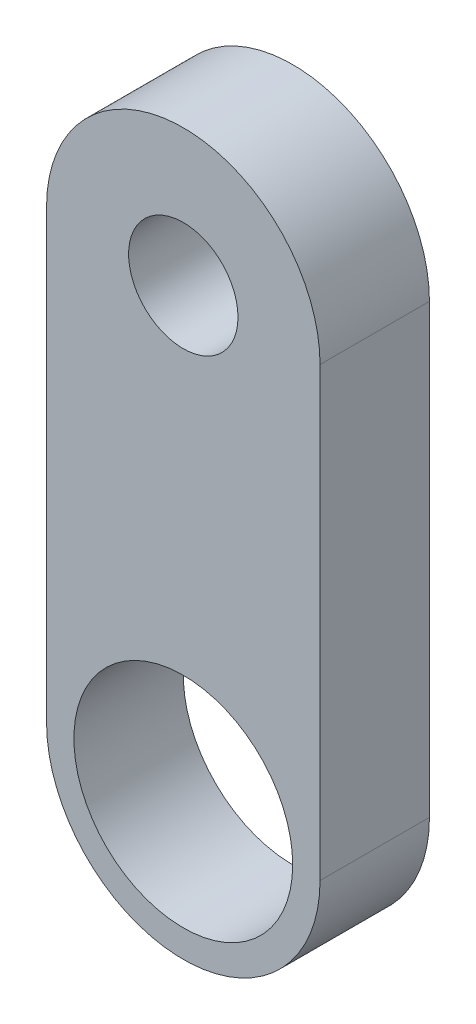
ISO-10303-21;
HEADER;
FILE_DESCRIPTION(('STEP AP214'),'2;1');
FILE_NAME('part.step','',(''),(''),'','','');
FILE_SCHEMA(('AUTOMOTIVE_DESIGN { 1 0 10303 214 1 1 1 1 }'));
ENDSEC;
DATA;
#1=APPLICATION_CONTEXT('core data for automotive mechanical design processes');
#2=APPLICATION_PROTOCOL_DEFINITION('international standard','automotive_design',2000,#1);
#3=PRODUCT_CONTEXT('',#1,'mechanical');
#4=PRODUCT('Part','Part','',(#3));
#5=PRODUCT_RELATED_PRODUCT_CATEGORY('part','',(#4));
#6=PRODUCT_DEFINITION_FORMATION('','',#4);
#7=PRODUCT_DEFINITION_CONTEXT('part definition',#1,'design');
#8=PRODUCT_DEFINITION('design','',#6,#7);
#9=PRODUCT_DEFINITION_SHAPE('','',#8);
#10=(LENGTH_UNIT() NAMED_UNIT(*) SI_UNIT(.MILLI.,.METRE.));
#11=(NAMED_UNIT(*) PLANE_ANGLE_UNIT() SI_UNIT($,.RADIAN.));
#12=(NAMED_UNIT(*) SI_UNIT($,.STERADIAN.) SOLID_ANGLE_UNIT());
#13=UNCERTAINTY_MEASURE_WITH_UNIT(LENGTH_MEASURE(1.E-05),#10,'distance_accuracy_value','');
#14=(GEOMETRIC_REPRESENTATION_CONTEXT(3) GLOBAL_UNCERTAINTY_ASSIGNED_CONTEXT((#13)) GLOBAL_UNIT_ASSIGNED_CONTEXT((#10,
#11,#12)) REPRESENTATION_CONTEXT('',''));
#15=CARTESIAN_POINT('',(0.,0.,0.));
#16=DIRECTION('',(0.,0.,1.));
#17=DIRECTION('',(1.,0.,0.));
#18=AXIS2_PLACEMENT_3D('',#15,#16,#17);
#19=CARTESIAN_POINT('',(0.,-4.08499999999997,2.));
#20=DIRECTION('',(0.,0.,-1.));
#21=DIRECTION('',(-1.,0.,0.));
#22=AXIS2_PLACEMENT_3D('',#19,#20,#21);
#23=PLANE('',#22);
#24=CARTESIAN_POINT('',(0.,-4.08499999999997,2.));
#25=DIRECTION('',(0.,0.,1.));
#26=DIRECTION('',(-1.,0.,0.));
#27=AXIS2_PLACEMENT_3D('',#24,#25,#26);
#28=CIRCLE('',#27,2.50000000000001);
#29=CARTESIAN_POINT('',(-2.50000000000002,-4.08500000000007,2.));
#30=VERTEX_POINT('',#29);
#31=CARTESIAN_POINT('',(2.5,-4.08499999999997,2.));
#32=VERTEX_POINT('',#31);
#33=EDGE_CURVE('E85',#30,#32,#28,.T.);
#34=ORIENTED_EDGE('',*,*,#33,.T.);
#35=DIRECTION('',(0.,1.,0.));
#36=VECTOR('',#35,1.);
#37=CARTESIAN_POINT('',(2.5,4.08500000000003,2.));
#38=LINE('',#37,#36);
#39=CARTESIAN_POINT('',(2.5,4.08500000000003,2.));
#40=VERTEX_POINT('',#39);
#41=EDGE_CURVE('E80',#32,#40,#38,.T.);
#42=ORIENTED_EDGE('',*,*,#41,.T.);
#43=CARTESIAN_POINT('',(0.,4.08500000000002,2.));
#44=DIRECTION('',(0.,0.,1.));
#45=DIRECTION('',(-1.,0.,0.));
#46=AXIS2_PLACEMENT_3D('',#43,#44,#45);
#47=CIRCLE('',#46,2.5);
#48=CARTESIAN_POINT('',(-2.5,4.08500000000001,2.));
#49=VERTEX_POINT('',#48);
#50=EDGE_CURVE('E83',#40,#49,#47,.T.);
#51=ORIENTED_EDGE('',*,*,#50,.T.);
#52=DIRECTION('',(0.,-1.,0.));
#53=VECTOR('',#52,1.);
#54=CARTESIAN_POINT('',(-2.5,4.08500000000001,2.));
#55=LINE('',#54,#53);
#56=EDGE_CURVE('E50',#49,#30,#55,.T.);
#57=ORIENTED_EDGE('',*,*,#56,.T.);
#58=EDGE_LOOP('',(#34,#42,#51,#57));
#59=FACE_BOUND('',#58,.T.);
#60=CARTESIAN_POINT('',(0.,4.08500000000002,2.));
#61=DIRECTION('',(0.,0.,1.));
#62=DIRECTION('',(1.,0.,0.));
#63=AXIS2_PLACEMENT_3D('',#60,#61,#62);
#64=CIRCLE('',#63,1.);
#65=CARTESIAN_POINT('',(1.,4.08500000000002,2.));
#66=VERTEX_POINT('',#65);
#67=EDGE_CURVE('E100',#66,#66,#64,.T.);
#68=ORIENTED_EDGE('',*,*,#67,.F.);
#69=EDGE_LOOP('',(#68));
#70=FACE_BOUND('',#69,.T.);
#71=CARTESIAN_POINT('',(0.,-4.08499999999997,2.));
#72=DIRECTION('',(0.,0.,1.));
#73=DIRECTION('',(1.,0.,0.));
#74=AXIS2_PLACEMENT_3D('',#71,#72,#73);
#75=CIRCLE('',#74,2.);
#76=CARTESIAN_POINT('',(2.,-4.08499999999997,2.));
#77=VERTEX_POINT('',#76);
#78=EDGE_CURVE('E115',#77,#77,#75,.T.);
#79=ORIENTED_EDGE('',*,*,#78,.F.);
#80=EDGE_LOOP('',(#79));
#81=FACE_BOUND('',#80,.T.);
#82=ADVANCED_FACE('F33',(#59,#70,#81),#23,.F.);
#83=CARTESIAN_POINT('',(0.,-4.08499999999997,0.));
#84=DIRECTION('',(0.,0.,-1.));
#85=DIRECTION('',(-1.,0.,0.));
#86=AXIS2_PLACEMENT_3D('',#83,#84,#85);
#87=PLANE('',#86);
#88=CARTESIAN_POINT('',(0.,4.08500000000002,0.));
#89=DIRECTION('',(0.,0.,1.));
#90=DIRECTION('',(1.,0.,0.));
#91=AXIS2_PLACEMENT_3D('',#88,#89,#90);
#92=CIRCLE('',#91,1.);
#93=CARTESIAN_POINT('',(1.,4.08500000000002,0.));
#94=VERTEX_POINT('',#93);
#95=EDGE_CURVE('E112',#94,#94,#92,.T.);
#96=ORIENTED_EDGE('',*,*,#95,.T.);
#97=EDGE_LOOP('',(#96));
#98=FACE_BOUND('',#97,.T.);
#99=CARTESIAN_POINT('',(0.,-4.08499999999997,0.));
#100=DIRECTION('',(0.,0.,1.));
#101=DIRECTION('',(-1.,0.,0.));
#102=AXIS2_PLACEMENT_3D('',#99,#100,#101);
#103=CIRCLE('',#102,2.50000000000001);
#104=CARTESIAN_POINT('',(-2.50000000000002,-4.08500000000007,0.));
#105=VERTEX_POINT('',#104);
#106=CARTESIAN_POINT('',(2.5,-4.08499999999997,0.));
#107=VERTEX_POINT('',#106);
#108=EDGE_CURVE('E97',#105,#107,#103,.T.);
#109=ORIENTED_EDGE('',*,*,#108,.F.);
#110=DIRECTION('',(0.,-1.,0.));
#111=VECTOR('',#110,1.);
#112=CARTESIAN_POINT('',(-2.5,4.08500000000001,0.));
#113=LINE('',#112,#111);
#114=CARTESIAN_POINT('',(-2.5,4.08500000000001,0.));
#115=VERTEX_POINT('',#114);
#116=EDGE_CURVE('E73',#115,#105,#113,.T.);
#117=ORIENTED_EDGE('',*,*,#116,.F.);
#118=CARTESIAN_POINT('',(0.,4.08500000000002,0.));
#119=DIRECTION('',(0.,0.,1.));
#120=DIRECTION('',(-1.,0.,0.));
#121=AXIS2_PLACEMENT_3D('',#118,#119,#120);
#122=CIRCLE('',#121,2.5);
#123=CARTESIAN_POINT('',(2.5,4.08500000000003,0.));
#124=VERTEX_POINT('',#123);
#125=EDGE_CURVE('E67',#124,#115,#122,.T.);
#126=ORIENTED_EDGE('',*,*,#125,.F.);
#127=DIRECTION('',(0.,1.,0.));
#128=VECTOR('',#127,1.);
#129=CARTESIAN_POINT('',(2.5,4.08500000000003,0.));
#130=LINE('',#129,#128);
#131=EDGE_CURVE('E89',#107,#124,#130,.T.);
#132=ORIENTED_EDGE('',*,*,#131,.F.);
#133=EDGE_LOOP('',(#109,#117,#126,#132));
#134=FACE_BOUND('',#133,.T.);
#135=CARTESIAN_POINT('',(0.,-4.08499999999997,0.));
#136=DIRECTION('',(0.,0.,1.));
#137=DIRECTION('',(1.,0.,0.));
#138=AXIS2_PLACEMENT_3D('',#135,#136,#137);
#139=CIRCLE('',#138,2.);
#140=CARTESIAN_POINT('',(2.,-4.08499999999997,0.));
#141=VERTEX_POINT('',#140);
#142=EDGE_CURVE('E118',#141,#141,#139,.T.);
#143=ORIENTED_EDGE('',*,*,#142,.T.);
#144=EDGE_LOOP('',(#143));
#145=FACE_BOUND('',#144,.T.);
#146=ADVANCED_FACE('F108',(#98,#134,#145),#87,.T.);
#147=CARTESIAN_POINT('',(0.,-4.08499999999997,2.));
#148=DIRECTION('',(0.,0.,-1.));
#149=DIRECTION('',(-1.,0.,0.));
#150=AXIS2_PLACEMENT_3D('',#147,#148,#149);
#151=CYLINDRICAL_SURFACE('',#150,2.50000000000001);
#152=ORIENTED_EDGE('',*,*,#108,.T.);
#153=DIRECTION('',(0.,0.,-1.));
#154=VECTOR('',#153,1.);
#155=CARTESIAN_POINT('',(2.5,-4.08499999999997,2.));
#156=LINE('',#155,#154);
#157=EDGE_CURVE('E11',#32,#107,#156,.T.);
#158=ORIENTED_EDGE('',*,*,#157,.F.);
#159=ORIENTED_EDGE('',*,*,#33,.F.);
#160=DIRECTION('',(0.,0.,-1.));
#161=VECTOR('',#160,1.);
#162=CARTESIAN_POINT('',(-2.50000000000002,-4.08500000000007,2.));
#163=LINE('',#162,#161);
#164=EDGE_CURVE('E93',#30,#105,#163,.T.);
#165=ORIENTED_EDGE('',*,*,#164,.T.);
#166=EDGE_LOOP('',(#152,#158,#159,#165));
#167=FACE_BOUND('',#166,.T.);
#168=ADVANCED_FACE('F35',(#167),#151,.T.);
#169=CARTESIAN_POINT('',(2.5,4.08500000000003,2.));
#170=DIRECTION('',(-1.,0.,0.));
#171=DIRECTION('',(0.,-1.,0.));
#172=AXIS2_PLACEMENT_3D('',#169,#170,#171);
#173=PLANE('',#172);
#174=ORIENTED_EDGE('',*,*,#131,.T.);
#175=DIRECTION('',(0.,0.,-1.));
#176=VECTOR('',#175,1.);
#177=CARTESIAN_POINT('',(2.5,4.08500000000003,2.));
#178=LINE('',#177,#176);
#179=EDGE_CURVE('E42',#40,#124,#178,.T.);
#180=ORIENTED_EDGE('',*,*,#179,.F.);
#181=ORIENTED_EDGE('',*,*,#41,.F.);
#182=ORIENTED_EDGE('',*,*,#157,.T.);
#183=EDGE_LOOP('',(#174,#180,#181,#182));
#184=FACE_BOUND('',#183,.T.);
#185=ADVANCED_FACE('F88',(#184),#173,.F.);
#186=CARTESIAN_POINT('',(0.,4.08500000000002,2.));
#187=DIRECTION('',(0.,0.,-1.));
#188=DIRECTION('',(-1.,0.,0.));
#189=AXIS2_PLACEMENT_3D('',#186,#187,#188);
#190=CYLINDRICAL_SURFACE('',#189,2.5);
#191=ORIENTED_EDGE('',*,*,#125,.T.);
#192=DIRECTION('',(0.,0.,-1.));
#193=VECTOR('',#192,1.);
#194=CARTESIAN_POINT('',(-2.5,4.08500000000001,2.));
#195=LINE('',#194,#193);
#196=EDGE_CURVE('E90',#49,#115,#195,.T.);
#197=ORIENTED_EDGE('',*,*,#196,.F.);
#198=ORIENTED_EDGE('',*,*,#50,.F.);
#199=ORIENTED_EDGE('',*,*,#179,.T.);
#200=EDGE_LOOP('',(#191,#197,#198,#199));
#201=FACE_BOUND('',#200,.T.);
#202=ADVANCED_FACE('F91',(#201),#190,.T.);
#203=CARTESIAN_POINT('',(-2.5,4.08500000000001,2.));
#204=DIRECTION('',(1.,0.,0.));
#205=DIRECTION('',(0.,1.,0.));
#206=AXIS2_PLACEMENT_3D('',#203,#204,#205);
#207=PLANE('',#206);
#208=ORIENTED_EDGE('',*,*,#116,.T.);
#209=ORIENTED_EDGE('',*,*,#164,.F.);
#210=ORIENTED_EDGE('',*,*,#56,.F.);
#211=ORIENTED_EDGE('',*,*,#196,.T.);
#212=EDGE_LOOP('',(#208,#209,#210,#211));
#213=FACE_BOUND('',#212,.T.);
#214=ADVANCED_FACE('F105',(#213),#207,.F.);
#215=CARTESIAN_POINT('',(0.,4.08500000000002,2.));
#216=DIRECTION('',(0.,0.,-1.));
#217=DIRECTION('',(-1.,0.,0.));
#218=AXIS2_PLACEMENT_3D('',#215,#216,#217);
#219=CYLINDRICAL_SURFACE('',#218,1.);
#220=ORIENTED_EDGE('',*,*,#67,.T.);
#221=EDGE_LOOP('',(#220));
#222=FACE_BOUND('',#221,.T.);
#223=ORIENTED_EDGE('',*,*,#95,.F.);
#224=EDGE_LOOP('',(#223));
#225=FACE_BOUND('',#224,.T.);
#226=ADVANCED_FACE('F135',(#222,#225),#219,.F.);
#227=CARTESIAN_POINT('',(0.,-4.08499999999997,2.));
#228=DIRECTION('',(0.,0.,-1.));
#229=DIRECTION('',(-1.,0.,0.));
#230=AXIS2_PLACEMENT_3D('',#227,#228,#229);
#231=CYLINDRICAL_SURFACE('',#230,2.);
#232=ORIENTED_EDGE('',*,*,#78,.T.);
#233=EDGE_LOOP('',(#232));
#234=FACE_BOUND('',#233,.T.);
#235=ORIENTED_EDGE('',*,*,#142,.F.);
#236=EDGE_LOOP('',(#235));
#237=FACE_BOUND('',#236,.T.);
#238=ADVANCED_FACE('F124',(#234,#237),#231,.F.);
#239=CLOSED_SHELL('',(#82,#146,#168,#185,#202,#214,#226,#238));
#240=MANIFOLD_SOLID_BREP('B2',#239);
#241=ADVANCED_BREP_SHAPE_REPRESENTATION('',(#18,#240),#14);
#242=SHAPE_DEFINITION_REPRESENTATION(#9,#241);
ENDSEC;
END-ISO-10303-21;
